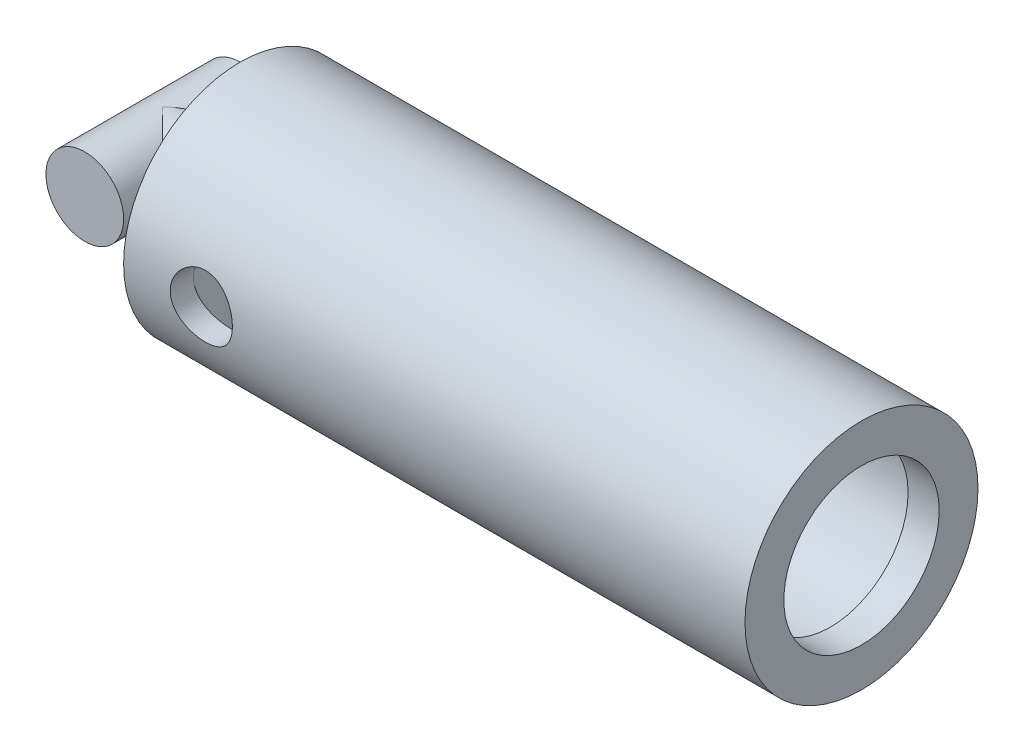
ISO-10303-21;
HEADER;
FILE_DESCRIPTION(('STEP AP214'),'2;1');
FILE_NAME('part.step','',(''),(''),'','','');
FILE_SCHEMA(('AUTOMOTIVE_DESIGN { 1 0 10303 214 1 1 1 1 }'));
ENDSEC;
DATA;
#1=APPLICATION_CONTEXT('core data for automotive mechanical design processes');
#2=APPLICATION_PROTOCOL_DEFINITION('international standard','automotive_design',2000,#1);
#3=PRODUCT_CONTEXT('',#1,'mechanical');
#4=PRODUCT('Part','Part','',(#3));
#5=PRODUCT_RELATED_PRODUCT_CATEGORY('part','',(#4));
#6=PRODUCT_DEFINITION_FORMATION('','',#4);
#7=PRODUCT_DEFINITION_CONTEXT('part definition',#1,'design');
#8=PRODUCT_DEFINITION('design','',#6,#7);
#9=PRODUCT_DEFINITION_SHAPE('','',#8);
#10=(LENGTH_UNIT() NAMED_UNIT(*) SI_UNIT(.MILLI.,.METRE.));
#11=(NAMED_UNIT(*) PLANE_ANGLE_UNIT() SI_UNIT($,.RADIAN.));
#12=(NAMED_UNIT(*) SI_UNIT($,.STERADIAN.) SOLID_ANGLE_UNIT());
#13=UNCERTAINTY_MEASURE_WITH_UNIT(LENGTH_MEASURE(1.E-05),#10,'distance_accuracy_value','');
#14=(GEOMETRIC_REPRESENTATION_CONTEXT(3) GLOBAL_UNCERTAINTY_ASSIGNED_CONTEXT((#13)) GLOBAL_UNIT_ASSIGNED_CONTEXT((#10,
#11,#12)) REPRESENTATION_CONTEXT('',''));
#15=CARTESIAN_POINT('',(0.,0.,0.));
#16=DIRECTION('',(0.,0.,1.));
#17=DIRECTION('',(1.,0.,0.));
#18=AXIS2_PLACEMENT_3D('',#15,#16,#17);
#19=CARTESIAN_POINT('',(0.,0.,0.));
#20=DIRECTION('',(1.,0.,0.));
#21=DIRECTION('',(0.,0.,-1.));
#22=AXIS2_PLACEMENT_3D('',#19,#20,#21);
#23=PLANE('',#22);
#24=CARTESIAN_POINT('',(0.,0.,0.));
#25=DIRECTION('',(1.,0.,0.));
#26=DIRECTION('',(0.,0.,-1.));
#27=AXIS2_PLACEMENT_3D('',#24,#25,#26);
#28=CIRCLE('',#27,7.5);
#29=CARTESIAN_POINT('',(0.,0.,-7.5));
#30=VERTEX_POINT('',#29);
#31=EDGE_CURVE('E87',#30,#30,#28,.T.);
#32=ORIENTED_EDGE('',*,*,#31,.F.);
#33=EDGE_LOOP('',(#32));
#34=FACE_BOUND('',#33,.T.);
#35=CARTESIAN_POINT('',(0.,0.,0.));
#36=DIRECTION('',(1.,0.,0.));
#37=DIRECTION('',(0.,0.,-1.));
#38=AXIS2_PLACEMENT_3D('',#35,#36,#37);
#39=CIRCLE('',#38,2.5);
#40=CARTESIAN_POINT('',(0.,0.,-2.5));
#41=VERTEX_POINT('',#40);
#42=EDGE_CURVE('E12',#41,#41,#39,.F.);
#43=ORIENTED_EDGE('',*,*,#42,.F.);
#44=EDGE_LOOP('',(#43));
#45=FACE_BOUND('',#44,.T.);
#46=ADVANCED_FACE('F35',(#34,#45),#23,.F.);
#47=CARTESIAN_POINT('',(40.,0.,0.));
#48=DIRECTION('',(-1.,0.,0.));
#49=DIRECTION('',(0.,0.,1.));
#50=AXIS2_PLACEMENT_3D('',#47,#48,#49);
#51=CYLINDRICAL_SURFACE('',#50,7.5);
#52=CARTESIAN_POINT('',(7.,0.,-7.5));
#53=CARTESIAN_POINT('',(6.99999738306515,0.110254555832854,-7.49999833810161));
#54=CARTESIAN_POINT('',(6.99085238581033,0.22053716022184,-7.49754486162151));
#55=CARTESIAN_POINT('',(6.95457876926131,0.437925451354464,-7.48799573621659));
#56=CARTESIAN_POINT('',(6.92744149557388,0.545029583319086,-7.48089785332586));
#57=CARTESIAN_POINT('',(6.85612833313597,0.752891589045312,-7.4628433325279));
#58=CARTESIAN_POINT('',(6.81197441233398,0.853657451015285,-7.45189167130375));
#59=CARTESIAN_POINT('',(6.70796275733338,1.04635368639266,-7.42728699151678));
#60=CARTESIAN_POINT('',(6.64810397664071,1.13828347044963,-7.4136337929518));
#61=CARTESIAN_POINT('',(6.51291648358663,1.31282950374002,-7.38474614901995));
#62=CARTESIAN_POINT('',(6.43729133199174,1.39521168986279,-7.36948467678681));
#63=CARTESIAN_POINT('',(6.27335151693665,1.54628713660638,-7.33927409679591));
#64=CARTESIAN_POINT('',(6.18503522238247,1.61497863495664,-7.32432502947243));
#65=CARTESIAN_POINT('',(5.99635176517455,1.73786409243415,-7.29615537464372));
#66=CARTESIAN_POINT('',(5.89580367173827,1.79178877736487,-7.28296888563239));
#67=CARTESIAN_POINT('',(5.68665988890757,1.88187548076994,-7.26021477318187));
#68=CARTESIAN_POINT('',(5.57806568766856,1.91804077451369,-7.25064648253265));
#69=CARTESIAN_POINT('',(5.35850446217499,1.97076920226504,-7.23649115802399));
#70=CARTESIAN_POINT('',(5.24764646006926,1.98775670244692,-7.2317964781149));
#71=CARTESIAN_POINT('',(5.02456231669346,2.0029703470582,-7.2275983091637));
#72=CARTESIAN_POINT('',(4.91233643497593,2.00119999705754,-7.22809385014446));
#73=CARTESIAN_POINT('',(4.69301458462594,1.97928510002699,-7.2341237880203));
#74=CARTESIAN_POINT('',(4.58586281796151,1.95965406064765,-7.23951735511531));
#75=CARTESIAN_POINT('',(4.37643166554376,1.90339748722183,-7.25451013080688));
#76=CARTESIAN_POINT('',(4.27415266992465,1.86677059492995,-7.26410967552612));
#77=CARTESIAN_POINT('',(4.07603185619142,1.77714356965256,-7.28655661748386));
#78=CARTESIAN_POINT('',(3.98027566071374,1.72396341137784,-7.29943942818703));
#79=CARTESIAN_POINT('',(3.79886584114848,1.60286503823778,-7.32698229642445));
#80=CARTESIAN_POINT('',(3.71321421084353,1.53494392224251,-7.34164270355186));
#81=CARTESIAN_POINT('',(3.5515110025452,1.38366607263419,-7.37167510629864));
#82=CARTESIAN_POINT('',(3.47586368168505,1.29987812728299,-7.38705471488831));
#83=CARTESIAN_POINT('',(3.33961121964971,1.12061766820637,-7.41636381276316));
#84=CARTESIAN_POINT('',(3.27900667129757,1.02514469420509,-7.43029324488555));
#85=CARTESIAN_POINT('',(3.17438209717535,0.824598255497451,-7.45521820398293));
#86=CARTESIAN_POINT('',(3.13043522955141,0.719484902551789,-7.4662007283356));
#87=CARTESIAN_POINT('',(3.06095281118663,0.503002294390395,-7.48390044400999));
#88=CARTESIAN_POINT('',(3.03541323727604,0.391634411928323,-7.49061856733749));
#89=CARTESIAN_POINT('',(3.00410512308217,0.169254083145515,-7.49889158558384));
#90=CARTESIAN_POINT('',(2.99778696014913,0.0583242376413797,-7.50058997470959));
#91=CARTESIAN_POINT('',(3.00358316424694,-0.163010045901199,-7.49904471691695));
#92=CARTESIAN_POINT('',(3.01569562610577,-0.273414537062114,-7.49580158080353));
#93=CARTESIAN_POINT('',(3.05755844745998,-0.48860244990178,-7.48483035496021));
#94=CARTESIAN_POINT('',(3.08700224619777,-0.593449852027783,-7.47718026546329));
#95=CARTESIAN_POINT('',(3.16233594450795,-0.796706971176065,-7.45826294894139));
#96=CARTESIAN_POINT('',(3.20822762625055,-0.895115989216028,-7.44699532996161));
#97=CARTESIAN_POINT('',(3.31617388718054,-1.08483847466795,-7.42175660559528));
#98=CARTESIAN_POINT('',(3.37852746679774,-1.17597518846118,-7.40773686604957));
#99=CARTESIAN_POINT('',(3.51725163015799,-1.34668463539715,-7.37861452365564));
#100=CARTESIAN_POINT('',(3.59362498260106,-1.42625507879918,-7.3635117072752));
#101=CARTESIAN_POINT('',(3.76078557749456,-1.57388924478774,-7.33339745866705));
#102=CARTESIAN_POINT('',(3.85191856139517,-1.64156519249816,-7.31840061429312));
#103=CARTESIAN_POINT('',(4.04456469609962,-1.76067191185118,-7.29066447182727));
#104=CARTESIAN_POINT('',(4.1460774136223,-1.81210336122161,-7.27792507956316));
#105=CARTESIAN_POINT('',(4.3560953070761,-1.89687411586112,-7.2562926837321));
#106=CARTESIAN_POINT('',(4.46455581181758,-1.93031812253958,-7.24737748318009));
#107=CARTESIAN_POINT('',(4.68583931967475,-1.97841205118791,-7.23439825126801));
#108=CARTESIAN_POINT('',(4.79866120034792,-1.99306677602478,-7.23033298020014));
#109=CARTESIAN_POINT('',(5.0214947878838,-2.00288989653714,-7.22761744573589));
#110=CARTESIAN_POINT('',(5.13147732025828,-1.99868155618109,-7.22879397743239));
#111=CARTESIAN_POINT('',(5.34910351401003,-1.97234376000439,-7.23602396081087));
#112=CARTESIAN_POINT('',(5.45674723550058,-1.95021476535025,-7.24207728699439));
#113=CARTESIAN_POINT('',(5.66585575212985,-1.88902515699699,-7.25827571073158));
#114=CARTESIAN_POINT('',(5.76736184273218,-1.8500966107558,-7.26838885019644));
#115=CARTESIAN_POINT('',(5.96247883053414,-1.75651554562386,-7.29156818136177));
#116=CARTESIAN_POINT('',(6.05608848630049,-1.70186056024617,-7.30463483621364));
#117=CARTESIAN_POINT('',(6.23573035949661,-1.57648909268817,-7.3327292144046));
#118=CARTESIAN_POINT('',(6.32145853497621,-1.50534729767909,-7.3478033310169));
#119=CARTESIAN_POINT('',(6.47996245166733,-1.349830535111,-7.37795503783007));
#120=CARTESIAN_POINT('',(6.55273503866884,-1.26545235435875,-7.39303262798441));
#121=CARTESIAN_POINT('',(6.68479223764686,-1.08367998108869,-7.42187812403968));
#122=CARTESIAN_POINT('',(6.74375501064933,-0.98604596175178,-7.43561111314551));
#123=CARTESIAN_POINT('',(6.84433741592936,-0.78188864041689,-7.45983810102897));
#124=CARTESIAN_POINT('',(6.8859681756636,-0.675371094696298,-7.47033417683594));
#125=CARTESIAN_POINT('',(6.94527528541552,-0.474374704880991,-7.48554752513468));
#126=CARTESIAN_POINT('',(6.9657493835925,-0.380762016565036,-7.49092770592602));
#127=CARTESIAN_POINT('',(6.99311220616706,-0.191439795317076,-7.49815449036456));
#128=CARTESIAN_POINT('',(7.00000227220002,-0.0957304704048604,-7.5000014429727));
#129=CARTESIAN_POINT('',(7.,0.,-7.5));
#130=B_SPLINE_CURVE_WITH_KNOTS('',3,(#52,#53,#54,#55,#56,#57,#58,#59,#60,#61,#62,#63,#64,#65,
#66,#67,#68,#69,#70,#71,#72,#73,#74,#75,#76,#77,#78,#79,#80,#81,#82,#83,#84,#85,#86,#87,#88,#89,
#90,#91,#92,#93,#94,#95,#96,#97,#98,#99,#100,#101,#102,#103,#104,#105,#106,#107,#108,#109,#110,
#111,#112,#113,#114,#115,#116,#117,#118,#119,#120,#121,#122,#123,#124,#125,#126,#127,#128,#129),
.UNSPECIFIED.,.T.,.F.,(4,2,2,2,2,2,2,2,2,2,2,2,2,2,2,2,2,2,2,2,2,2,2,2,2,2,2,2,2,2,2,2,2,2,2,2,
2,2,4),(0.,0.330412598949569,0.66098424376145,0.991130552971932,1.32129886708675,
1.65834897954967,1.99544244925149,2.33832582523229,2.681145941297,3.01622158250468,
3.3512346040432,3.67691002045997,4.0026114681294,4.33198673346498,4.6614268811763,
5.00161259812322,5.34181171937597,5.68348809603041,6.02508977190139,6.35682717524547,
6.68853028925351,7.01453535642116,7.34057575775614,7.6730028600455,8.00549568258887,
8.34736496382788,8.68921998024107,9.02906297699387,9.36881908663983,9.69743342403611,
10.0260393052059,10.352107654483,10.67822717123,11.0139433957139,11.3497412433245,
11.692722522809,12.0354832614518,12.3223981899334,12.6092847796638),.UNSPECIFIED.);
#131=CARTESIAN_POINT('',(7.,0.,-7.5));
#132=VERTEX_POINT('',#131);
#133=EDGE_CURVE('E143',#132,#132,#130,.T.);
#134=ORIENTED_EDGE('',*,*,#133,.T.);
#135=EDGE_LOOP('',(#134));
#136=FACE_BOUND('',#135,.T.);
#137=CARTESIAN_POINT('',(7.,0.,7.5));
#138=CARTESIAN_POINT('',(6.99999738306515,-0.110254555832854,7.49999833810161));
#139=CARTESIAN_POINT('',(6.99085238581033,-0.22053716022184,7.49754486162151));
#140=CARTESIAN_POINT('',(6.95457876926131,-0.437925451354464,7.48799573621659));
#141=CARTESIAN_POINT('',(6.92744149557388,-0.545029583319086,7.48089785332586));
#142=CARTESIAN_POINT('',(6.85612833313597,-0.752891589045312,7.4628433325279));
#143=CARTESIAN_POINT('',(6.81197441233398,-0.853657451015285,7.45189167130375));
#144=CARTESIAN_POINT('',(6.70796275733338,-1.04635368639266,7.42728699151678));
#145=CARTESIAN_POINT('',(6.64810397664071,-1.13828347044963,7.4136337929518));
#146=CARTESIAN_POINT('',(6.51291648358663,-1.31282950374002,7.38474614901995));
#147=CARTESIAN_POINT('',(6.43729133199174,-1.39521168986279,7.36948467678681));
#148=CARTESIAN_POINT('',(6.27335151693665,-1.54628713660638,7.33927409679591));
#149=CARTESIAN_POINT('',(6.18503522238247,-1.61497863495664,7.32432502947243));
#150=CARTESIAN_POINT('',(5.99635176517455,-1.73786409243415,7.29615537464372));
#151=CARTESIAN_POINT('',(5.89580367173827,-1.79178877736487,7.28296888563239));
#152=CARTESIAN_POINT('',(5.68665988890757,-1.88187548076994,7.26021477318187));
#153=CARTESIAN_POINT('',(5.57806568766856,-1.91804077451369,7.25064648253265));
#154=CARTESIAN_POINT('',(5.35850446217499,-1.97076920226504,7.23649115802399));
#155=CARTESIAN_POINT('',(5.24764646006926,-1.98775670244692,7.2317964781149));
#156=CARTESIAN_POINT('',(5.02456231669346,-2.0029703470582,7.2275983091637));
#157=CARTESIAN_POINT('',(4.91233643497593,-2.00119999705754,7.22809385014446));
#158=CARTESIAN_POINT('',(4.69301458462594,-1.97928510002699,7.2341237880203));
#159=CARTESIAN_POINT('',(4.58586281796151,-1.95965406064765,7.23951735511531));
#160=CARTESIAN_POINT('',(4.37643166554376,-1.90339748722183,7.25451013080688));
#161=CARTESIAN_POINT('',(4.27415266992465,-1.86677059492995,7.26410967552612));
#162=CARTESIAN_POINT('',(4.07603185619142,-1.77714356965256,7.28655661748386));
#163=CARTESIAN_POINT('',(3.98027566071374,-1.72396341137784,7.29943942818703));
#164=CARTESIAN_POINT('',(3.79886584114848,-1.60286503823778,7.32698229642445));
#165=CARTESIAN_POINT('',(3.71321421084353,-1.53494392224251,7.34164270355186));
#166=CARTESIAN_POINT('',(3.5515110025452,-1.38366607263419,7.37167510629864));
#167=CARTESIAN_POINT('',(3.47586368168505,-1.29987812728299,7.38705471488831));
#168=CARTESIAN_POINT('',(3.33961121964971,-1.12061766820637,7.41636381276316));
#169=CARTESIAN_POINT('',(3.27900667129757,-1.02514469420509,7.43029324488555));
#170=CARTESIAN_POINT('',(3.17438209717535,-0.824598255497451,7.45521820398293));
#171=CARTESIAN_POINT('',(3.13043522955141,-0.719484902551789,7.4662007283356));
#172=CARTESIAN_POINT('',(3.06095281118663,-0.503002294390395,7.48390044400999));
#173=CARTESIAN_POINT('',(3.03541323727604,-0.391634411928323,7.49061856733749));
#174=CARTESIAN_POINT('',(3.00410512308217,-0.169254083145515,7.49889158558384));
#175=CARTESIAN_POINT('',(2.99778696014913,-0.0583242376413797,7.50058997470959));
#176=CARTESIAN_POINT('',(3.00358316424694,0.163010045901199,7.49904471691695));
#177=CARTESIAN_POINT('',(3.01569562610577,0.273414537062114,7.49580158080353));
#178=CARTESIAN_POINT('',(3.05755844745998,0.48860244990178,7.48483035496021));
#179=CARTESIAN_POINT('',(3.08700224619777,0.593449852027783,7.47718026546329));
#180=CARTESIAN_POINT('',(3.16233594450795,0.796706971176065,7.45826294894139));
#181=CARTESIAN_POINT('',(3.20822762625055,0.895115989216028,7.44699532996161));
#182=CARTESIAN_POINT('',(3.31617388718054,1.08483847466795,7.42175660559528));
#183=CARTESIAN_POINT('',(3.37852746679774,1.17597518846118,7.40773686604957));
#184=CARTESIAN_POINT('',(3.51725163015799,1.34668463539715,7.37861452365564));
#185=CARTESIAN_POINT('',(3.59362498260106,1.42625507879918,7.3635117072752));
#186=CARTESIAN_POINT('',(3.76078557749456,1.57388924478774,7.33339745866705));
#187=CARTESIAN_POINT('',(3.85191856139517,1.64156519249816,7.31840061429312));
#188=CARTESIAN_POINT('',(4.04456469609962,1.76067191185118,7.29066447182727));
#189=CARTESIAN_POINT('',(4.1460774136223,1.81210336122161,7.27792507956316));
#190=CARTESIAN_POINT('',(4.3560953070761,1.89687411586112,7.2562926837321));
#191=CARTESIAN_POINT('',(4.46455581181758,1.93031812253958,7.24737748318009));
#192=CARTESIAN_POINT('',(4.68583931967475,1.97841205118791,7.23439825126801));
#193=CARTESIAN_POINT('',(4.79866120034792,1.99306677602478,7.23033298020014));
#194=CARTESIAN_POINT('',(5.0214947878838,2.00288989653714,7.22761744573589));
#195=CARTESIAN_POINT('',(5.13147732025828,1.99868155618109,7.22879397743239));
#196=CARTESIAN_POINT('',(5.34910351401003,1.97234376000439,7.23602396081087));
#197=CARTESIAN_POINT('',(5.45674723550058,1.95021476535025,7.24207728699439));
#198=CARTESIAN_POINT('',(5.66585575212985,1.88902515699699,7.25827571073158));
#199=CARTESIAN_POINT('',(5.76736184273218,1.8500966107558,7.26838885019644));
#200=CARTESIAN_POINT('',(5.96247883053414,1.75651554562386,7.29156818136177));
#201=CARTESIAN_POINT('',(6.05608848630049,1.70186056024617,7.30463483621364));
#202=CARTESIAN_POINT('',(6.23573035949661,1.57648909268817,7.3327292144046));
#203=CARTESIAN_POINT('',(6.32145853497621,1.50534729767909,7.3478033310169));
#204=CARTESIAN_POINT('',(6.47996245166733,1.349830535111,7.37795503783007));
#205=CARTESIAN_POINT('',(6.55273503866884,1.26545235435875,7.39303262798441));
#206=CARTESIAN_POINT('',(6.68479223764686,1.08367998108869,7.42187812403968));
#207=CARTESIAN_POINT('',(6.74375501064933,0.98604596175178,7.43561111314551));
#208=CARTESIAN_POINT('',(6.84433741592936,0.78188864041689,7.45983810102897));
#209=CARTESIAN_POINT('',(6.8859681756636,0.675371094696298,7.47033417683594));
#210=CARTESIAN_POINT('',(6.94527528541552,0.474374704880991,7.48554752513468));
#211=CARTESIAN_POINT('',(6.9657493835925,0.380762016565036,7.49092770592602));
#212=CARTESIAN_POINT('',(6.99311220616706,0.191439795317076,7.49815449036456));
#213=CARTESIAN_POINT('',(7.00000227220002,0.0957304704048604,7.5000014429727));
#214=CARTESIAN_POINT('',(7.,0.,7.5));
#215=B_SPLINE_CURVE_WITH_KNOTS('',3,(#137,#138,#139,#140,#141,#142,#143,#144,#145,#146,#147,
#148,#149,#150,#151,#152,#153,#154,#155,#156,#157,#158,#159,#160,#161,#162,#163,#164,#165,#166,
#167,#168,#169,#170,#171,#172,#173,#174,#175,#176,#177,#178,#179,#180,#181,#182,#183,#184,#185,
#186,#187,#188,#189,#190,#191,#192,#193,#194,#195,#196,#197,#198,#199,#200,#201,#202,#203,#204,
#205,#206,#207,#208,#209,#210,#211,#212,#213,#214),.UNSPECIFIED.,.T.,.F.,(4,2,2,2,2,2,2,2,2,2,2,
2,2,2,2,2,2,2,2,2,2,2,2,2,2,2,2,2,2,2,2,2,2,2,2,2,2,2,4),(0.,0.330412598949569,0.66098424376145,
0.991130552971932,1.32129886708675,1.65834897954967,1.99544244925149,2.33832582523229,
2.681145941297,3.01622158250468,3.3512346040432,3.67691002045997,4.0026114681294,
4.33198673346498,4.6614268811763,5.00161259812322,5.34181171937597,5.68348809603041,
6.02508977190139,6.35682717524547,6.68853028925351,7.01453535642116,7.34057575775614,
7.6730028600455,8.00549568258887,8.34736496382788,8.68921998024107,9.02906297699387,
9.36881908663983,9.69743342403611,10.0260393052059,10.352107654483,10.67822717123,
11.0139433957139,11.3497412433245,11.692722522809,12.0354832614518,12.3223981899334,
12.6092847796638),.UNSPECIFIED.);
#216=CARTESIAN_POINT('',(7.,0.,7.5));
#217=VERTEX_POINT('',#216);
#218=EDGE_CURVE('E130',#217,#217,#215,.T.);
#219=ORIENTED_EDGE('',*,*,#218,.T.);
#220=EDGE_LOOP('',(#219));
#221=FACE_BOUND('',#220,.T.);
#222=CARTESIAN_POINT('',(40.,0.,0.));
#223=DIRECTION('',(1.,0.,0.));
#224=DIRECTION('',(0.,0.,-1.));
#225=AXIS2_PLACEMENT_3D('',#222,#223,#224);
#226=CIRCLE('',#225,7.5);
#227=CARTESIAN_POINT('',(40.,0.,-7.5));
#228=VERTEX_POINT('',#227);
#229=EDGE_CURVE('E44',#228,#228,#226,.T.);
#230=ORIENTED_EDGE('',*,*,#229,.F.);
#231=EDGE_LOOP('',(#230));
#232=FACE_BOUND('',#231,.T.);
#233=ORIENTED_EDGE('',*,*,#31,.T.);
#234=EDGE_LOOP('',(#233));
#235=FACE_BOUND('',#234,.T.);
#236=ADVANCED_FACE('F37',(#136,#221,#232,#235),#51,.T.);
#237=CARTESIAN_POINT('',(40.,0.,0.));
#238=DIRECTION('',(1.,0.,0.));
#239=DIRECTION('',(0.,0.,-1.));
#240=AXIS2_PLACEMENT_3D('',#237,#238,#239);
#241=PLANE('',#240);
#242=CARTESIAN_POINT('',(40.,0.,0.));
#243=DIRECTION('',(1.,0.,0.));
#244=DIRECTION('',(0.,0.,-1.));
#245=AXIS2_PLACEMENT_3D('',#242,#243,#244);
#246=CIRCLE('',#245,5.);
#247=CARTESIAN_POINT('',(40.,0.,-5.));
#248=VERTEX_POINT('',#247);
#249=EDGE_CURVE('E84',#248,#248,#246,.T.);
#250=ORIENTED_EDGE('',*,*,#249,.F.);
#251=EDGE_LOOP('',(#250));
#252=FACE_BOUND('',#251,.T.);
#253=ORIENTED_EDGE('',*,*,#229,.T.);
#254=EDGE_LOOP('',(#253));
#255=FACE_BOUND('',#254,.T.);
#256=ADVANCED_FACE('F171',(#252,#255),#241,.T.);
#257=CARTESIAN_POINT('',(38.,0.,0.));
#258=DIRECTION('',(1.,0.,0.));
#259=DIRECTION('',(0.,0.,-1.));
#260=AXIS2_PLACEMENT_3D('',#257,#258,#259);
#261=CYLINDRICAL_SURFACE('',#260,5.);
#262=CARTESIAN_POINT('',(38.,0.,0.));
#263=DIRECTION('',(1.,0.,0.));
#264=DIRECTION('',(0.,0.,-1.));
#265=AXIS2_PLACEMENT_3D('',#262,#263,#264);
#266=CIRCLE('',#265,5.);
#267=CARTESIAN_POINT('',(38.,0.,-5.));
#268=VERTEX_POINT('',#267);
#269=EDGE_CURVE('E80',#268,#268,#266,.F.);
#270=ORIENTED_EDGE('',*,*,#269,.T.);
#271=EDGE_LOOP('',(#270));
#272=FACE_BOUND('',#271,.T.);
#273=ORIENTED_EDGE('',*,*,#249,.T.);
#274=EDGE_LOOP('',(#273));
#275=FACE_BOUND('',#274,.T.);
#276=ADVANCED_FACE('F114',(#272,#275),#261,.F.);
#277=CARTESIAN_POINT('',(38.,0.,0.));
#278=DIRECTION('',(1.,0.,0.));
#279=DIRECTION('',(0.,0.,-1.));
#280=AXIS2_PLACEMENT_3D('',#277,#278,#279);
#281=PLANE('',#280);
#282=CARTESIAN_POINT('',(38.,0.,0.));
#283=DIRECTION('',(1.,0.,0.));
#284=DIRECTION('',(0.,0.,-1.));
#285=AXIS2_PLACEMENT_3D('',#282,#283,#284);
#286=CIRCLE('',#285,6.);
#287=CARTESIAN_POINT('',(38.,0.,-6.));
#288=VERTEX_POINT('',#287);
#289=EDGE_CURVE('E71',#288,#288,#286,.T.);
#290=ORIENTED_EDGE('',*,*,#289,.F.);
#291=EDGE_LOOP('',(#290));
#292=FACE_BOUND('',#291,.T.);
#293=ORIENTED_EDGE('',*,*,#269,.F.);
#294=EDGE_LOOP('',(#293));
#295=FACE_BOUND('',#294,.T.);
#296=ADVANCED_FACE('F111',(#292,#295),#281,.F.);
#297=CARTESIAN_POINT('',(3.,0.,0.));
#298=DIRECTION('',(1.,0.,0.));
#299=DIRECTION('',(0.,0.,-1.));
#300=AXIS2_PLACEMENT_3D('',#297,#298,#299);
#301=CYLINDRICAL_SURFACE('',#300,6.);
#302=CARTESIAN_POINT('',(3.,0.,0.));
#303=DIRECTION('',(1.,0.,0.));
#304=DIRECTION('',(0.,0.,-1.));
#305=AXIS2_PLACEMENT_3D('',#302,#303,#304);
#306=CIRCLE('',#305,6.);
#307=CARTESIAN_POINT('',(3.,0.,-6.));
#308=VERTEX_POINT('',#307);
#309=CARTESIAN_POINT('',(3.,0.,6.));
#310=VERTEX_POINT('',#309);
#311=EDGE_CURVE('E78',#308,#310,#306,.T.);
#312=ORIENTED_EDGE('',*,*,#311,.F.);
#313=CARTESIAN_POINT('',(3.,0.,-6.));
#314=CARTESIAN_POINT('',(2.99999949253672,0.109126725773447,-6.00000030601888));
#315=CARTESIAN_POINT('',(3.00896053225443,0.2182503890771,-5.9969953901509));
#316=CARTESIAN_POINT('',(3.04445821763444,0.433283521745944,-5.98530420406562));
#317=CARTESIAN_POINT('',(3.07099668789784,0.539192656237635,-5.97661734404305));
#318=CARTESIAN_POINT('',(3.1406384867681,0.744665579003552,-5.95450615812885));
#319=CARTESIAN_POINT('',(3.18371412491854,0.844239651772068,-5.94108975461707));
#320=CARTESIAN_POINT('',(3.28508234567669,1.03474987361065,-5.91088891434684));
#321=CARTESIAN_POINT('',(3.3433779300052,1.12568431391741,-5.89410381335556));
#322=CARTESIAN_POINT('',(3.4756516097175,1.29948335004453,-5.8582818888601));
#323=CARTESIAN_POINT('',(3.55006246852099,1.38200740059662,-5.8391911292757));
#324=CARTESIAN_POINT('',(3.71153430941313,1.53366538540417,-5.80120629566243));
#325=CARTESIAN_POINT('',(3.79859806985702,1.60279637097893,-5.78231226581098));
#326=CARTESIAN_POINT('',(3.98597023039292,1.72764988445572,-5.74626664954548));
#327=CARTESIAN_POINT('',(4.08658747946424,1.78292971644206,-5.72918078551376));
#328=CARTESIAN_POINT('',(4.29635218891709,1.87563774775544,-5.69950610837202));
#329=CARTESIAN_POINT('',(4.40549703432549,1.91307139477353,-5.68691592321491));
#330=CARTESIAN_POINT('',(4.62534644299342,1.96774692301833,-5.66822606538755));
#331=CARTESIAN_POINT('',(4.73587441697813,1.98562689654354,-5.66192191539223));
#332=CARTESIAN_POINT('',(4.95852750831176,2.00268224666895,-5.65591313259015));
#333=CARTESIAN_POINT('',(5.07065212141838,2.00186340320944,-5.6562064604546));
#334=CARTESIAN_POINT('',(5.28787326088804,1.98203980740684,-5.6631803001636));
#335=CARTESIAN_POINT('',(5.39305680583804,1.96386782633399,-5.66956831735066));
#336=CARTESIAN_POINT('',(5.59878683921367,1.91121232569884,-5.68753315449102));
#337=CARTESIAN_POINT('',(5.69933277087014,1.87672685318374,-5.69911059568215));
#338=CARTESIAN_POINT('',(5.89482549918296,1.79187811612042,-5.72635822262498));
#339=CARTESIAN_POINT('',(5.98965605093905,1.74126809741453,-5.74209131586235));
#340=CARTESIAN_POINT('',(6.16974181655945,1.62577821260628,-5.77585117151453));
#341=CARTESIAN_POINT('',(6.25499425386676,1.56089422472801,-5.79387859580927));
#342=CARTESIAN_POINT('',(6.41818319632154,1.41469866536448,-5.83134658335482));
#343=CARTESIAN_POINT('',(6.49550538901814,1.33270630015262,-5.85081178709686));
#344=CARTESIAN_POINT('',(6.6354625333268,1.15667913994013,-5.88813876774073));
#345=CARTESIAN_POINT('',(6.69809607632899,1.06264319132163,-5.90600039076135));
#346=CARTESIAN_POINT('',(6.80739260047014,0.863895226092536,-5.93834215875587));
#347=CARTESIAN_POINT('',(6.85389098268146,0.759086552832673,-5.95278700016078));
#348=CARTESIAN_POINT('',(6.92840634791142,0.542538166729015,-5.9764113428887));
#349=CARTESIAN_POINT('',(6.95642975084688,0.430800876309908,-5.98559267309759));
#350=CARTESIAN_POINT('',(6.99211133204472,0.208767659058609,-5.99735254142881));
#351=CARTESIAN_POINT('',(7.0005996183455,0.0986191997296928,-6.00020003667456));
#352=CARTESIAN_POINT('',(6.99933465280306,-0.121550139920474,-5.99977805389655));
#353=CARTESIAN_POINT('',(6.98958448004025,-0.2315710386393,-5.99650960838725));
#354=CARTESIAN_POINT('',(6.95277618452808,-0.445039732608511,-5.98440049434209));
#355=CARTESIAN_POINT('',(6.92622758790101,-0.548585613669687,-5.97572397422385));
#356=CARTESIAN_POINT('',(6.85721311106654,-0.749711917159147,-5.9538369366014));
#357=CARTESIAN_POINT('',(6.81474520106443,-0.847291577017213,-5.9406258409335));
#358=CARTESIAN_POINT('',(6.71385913631843,-1.03657659278655,-5.91057862574579));
#359=CARTESIAN_POINT('',(6.65505081343366,-1.12805991843429,-5.89365629511572));
#360=CARTESIAN_POINT('',(6.52361169997303,-1.30012966027117,-5.85810507832525));
#361=CARTESIAN_POINT('',(6.45097668793647,-1.38071273559115,-5.83947567187655));
#362=CARTESIAN_POINT('',(6.29004249798682,-1.5325050156126,-5.8015369596089));
#363=CARTESIAN_POINT('',(6.20118154614628,-1.60312193849154,-5.78223522174856));
#364=CARTESIAN_POINT('',(6.01245686437823,-1.72851504464715,-5.74599946589418));
#365=CARTESIAN_POINT('',(5.91259304273185,-1.78329109586203,-5.72906546764005));
#366=CARTESIAN_POINT('',(5.70465396942021,-1.87519386083272,-5.69964783582767));
#367=CARTESIAN_POINT('',(5.59659584166247,-1.91235626433004,-5.68715521585958));
#368=CARTESIAN_POINT('',(5.37524269991174,-1.96778933351871,-5.66821664612899));
#369=CARTESIAN_POINT('',(5.2619500691913,-1.98606850990788,-5.66176797247279));
#370=CARTESIAN_POINT('',(5.03960580791817,-2.00255256495468,-5.65595717748354));
#371=CARTESIAN_POINT('',(4.93063531942635,-2.0017405146168,-5.6562480051483));
#372=CARTESIAN_POINT('',(4.71446985015587,-1.98248458689739,-5.66302539647735));
#373=CARTESIAN_POINT('',(4.60727476408982,-1.96404175891717,-5.66951159138723));
#374=CARTESIAN_POINT('',(4.39972867399505,-1.91074362625869,-5.68769048609783));
#375=CARTESIAN_POINT('',(4.29928634999101,-1.87620669203103,-5.69928196044955));
#376=CARTESIAN_POINT('',(4.10554518612346,-1.79195873151949,-5.72632797636937));
#377=CARTESIAN_POINT('',(4.01224793762399,-1.74224433710761,-5.74178337526786));
#378=CARTESIAN_POINT('',(3.83103266015418,-1.62652138516686,-5.77565658452093));
#379=CARTESIAN_POINT('',(3.74352699620323,-1.55989648552916,-5.79417423284274));
#380=CARTESIAN_POINT('',(3.5806203732316,-1.4132857662713,-5.83166712566506));
#381=CARTESIAN_POINT('',(3.50522284862385,-1.33329616890296,-5.85064249824745));
#382=CARTESIAN_POINT('',(3.36571117542164,-1.15848311384138,-5.88780061051088));
#383=CARTESIAN_POINT('',(3.302151304498,-1.06320302699946,-5.90592363602513));
#384=CARTESIAN_POINT('',(3.19201914229871,-0.862714714813249,-5.93851982345224));
#385=CARTESIAN_POINT('',(3.14544250815592,-0.757509036264697,-5.9529939181586));
#386=CARTESIAN_POINT('',(3.07255673502266,-0.544987294401952,-5.97611030137084));
#387=CARTESIAN_POINT('',(3.04543506747325,-0.437975515352818,-5.98498424845045));
#388=CARTESIAN_POINT('',(3.00915943864575,-0.220640832020494,-5.99692814128444));
#389=CARTESIAN_POINT('',(3.00000051300693,-0.110318851137493,-5.9999996906381));
#390=CARTESIAN_POINT('',(3.,0.,-6.));
#391=B_SPLINE_CURVE_WITH_KNOTS('',3,(#313,#314,#315,#316,#317,#318,#319,#320,#321,#322,#323,
#324,#325,#326,#327,#328,#329,#330,#331,#332,#333,#334,#335,#336,#337,#338,#339,#340,#341,#342,
#343,#344,#345,#346,#347,#348,#349,#350,#351,#352,#353,#354,#355,#356,#357,#358,#359,#360,#361,
#362,#363,#364,#365,#366,#367,#368,#369,#370,#371,#372,#373,#374,#375,#376,#377,#378,#379,#380,
#381,#382,#383,#384,#385,#386,#387,#388,#389,#390),.UNSPECIFIED.,.T.,.F.,(4,2,2,2,2,2,2,2,2,2,2,
2,2,2,2,2,2,2,2,2,2,2,2,2,2,2,2,2,2,2,2,2,2,2,2,2,2,2,4),(0.,0.326974212052022,
0.653982370535041,0.980445345740548,1.3069727555982,1.64369368565512,1.98048866575061,
2.32696769646941,2.67334089385667,3.0080385148368,3.34263267974971,3.6619365310256,
3.98127861710964,4.30576342310261,4.63034205116414,4.97186611622734,5.31342291933237,
5.65836811300715,6.00319337754417,6.33307166350339,6.66289426328353,6.98316315956427,
7.30347290568208,7.63220799687473,7.96104361643783,8.30482045761504,8.64860016469994,
8.99168027653541,9.3346056941168,9.65991332128517,9.98520158702751,10.3043117416084,
10.6234927635196,10.9566013338361,11.2898042224756,11.635993216702,11.9820936230491,
12.3127311674763,12.6432773207628),.UNSPECIFIED.);
#392=EDGE_CURVE('E54',#308,#308,#391,.T.);
#393=ORIENTED_EDGE('',*,*,#392,.T.);
#394=EDGE_CURVE('E74',#310,#308,#306,.T.);
#395=ORIENTED_EDGE('',*,*,#394,.F.);
#396=CARTESIAN_POINT('',(3.,0.,6.));
#397=CARTESIAN_POINT('',(2.99999949253671,-0.109126725773446,6.00000030601888));
#398=CARTESIAN_POINT('',(3.00896053225443,-0.218250389077099,5.9969953901509));
#399=CARTESIAN_POINT('',(3.04445821763444,-0.433283521745944,5.98530420406562));
#400=CARTESIAN_POINT('',(3.07099668789784,-0.539192656237635,5.97661734404305));
#401=CARTESIAN_POINT('',(3.1406384867681,-0.744665579003552,5.95450615812885));
#402=CARTESIAN_POINT('',(3.18371412491854,-0.844239651772068,5.94108975461707));
#403=CARTESIAN_POINT('',(3.28508234567669,-1.03474987361065,5.91088891434684));
#404=CARTESIAN_POINT('',(3.3433779300052,-1.12568431391741,5.89410381335556));
#405=CARTESIAN_POINT('',(3.4756516097175,-1.29948335004453,5.8582818888601));
#406=CARTESIAN_POINT('',(3.55006246852099,-1.38200740059662,5.8391911292757));
#407=CARTESIAN_POINT('',(3.71153430941313,-1.53366538540417,5.80120629566243));
#408=CARTESIAN_POINT('',(3.79859806985702,-1.60279637097893,5.78231226581098));
#409=CARTESIAN_POINT('',(3.98597023039292,-1.72764988445572,5.74626664954548));
#410=CARTESIAN_POINT('',(4.08658747946424,-1.78292971644206,5.72918078551376));
#411=CARTESIAN_POINT('',(4.29635218891709,-1.87563774775544,5.69950610837202));
#412=CARTESIAN_POINT('',(4.40549703432549,-1.91307139477353,5.68691592321491));
#413=CARTESIAN_POINT('',(4.62534644299342,-1.96774692301833,5.66822606538755));
#414=CARTESIAN_POINT('',(4.73587441697813,-1.98562689654354,5.66192191539223));
#415=CARTESIAN_POINT('',(4.95852750831176,-2.00268224666895,5.65591313259015));
#416=CARTESIAN_POINT('',(5.07065212141838,-2.00186340320944,5.6562064604546));
#417=CARTESIAN_POINT('',(5.28787326088804,-1.98203980740684,5.6631803001636));
#418=CARTESIAN_POINT('',(5.39305680583804,-1.96386782633399,5.66956831735066));
#419=CARTESIAN_POINT('',(5.59878683921367,-1.91121232569884,5.68753315449102));
#420=CARTESIAN_POINT('',(5.69933277087014,-1.87672685318374,5.69911059568215));
#421=CARTESIAN_POINT('',(5.89482549918296,-1.79187811612042,5.72635822262498));
#422=CARTESIAN_POINT('',(5.98965605093905,-1.74126809741453,5.74209131586235));
#423=CARTESIAN_POINT('',(6.16974181655945,-1.62577821260628,5.77585117151453));
#424=CARTESIAN_POINT('',(6.25499425386676,-1.56089422472801,5.79387859580927));
#425=CARTESIAN_POINT('',(6.41818319632154,-1.41469866536448,5.83134658335482));
#426=CARTESIAN_POINT('',(6.49550538901814,-1.33270630015262,5.85081178709686));
#427=CARTESIAN_POINT('',(6.6354625333268,-1.15667913994013,5.88813876774073));
#428=CARTESIAN_POINT('',(6.69809607632899,-1.06264319132163,5.90600039076135));
#429=CARTESIAN_POINT('',(6.80739260047014,-0.863895226092536,5.93834215875587));
#430=CARTESIAN_POINT('',(6.85389098268146,-0.759086552832673,5.95278700016078));
#431=CARTESIAN_POINT('',(6.92840634791142,-0.542538166729015,5.9764113428887));
#432=CARTESIAN_POINT('',(6.95642975084688,-0.430800876309908,5.98559267309759));
#433=CARTESIAN_POINT('',(6.99211133204472,-0.208767659058609,5.99735254142881));
#434=CARTESIAN_POINT('',(7.0005996183455,-0.0986191997296928,6.00020003667456));
#435=CARTESIAN_POINT('',(6.99933465280306,0.121550139920474,5.99977805389655));
#436=CARTESIAN_POINT('',(6.98958448004025,0.2315710386393,5.99650960838725));
#437=CARTESIAN_POINT('',(6.95277618452808,0.445039732608511,5.98440049434209));
#438=CARTESIAN_POINT('',(6.92622758790101,0.548585613669687,5.97572397422385));
#439=CARTESIAN_POINT('',(6.85721311106654,0.749711917159147,5.9538369366014));
#440=CARTESIAN_POINT('',(6.81474520106443,0.847291577017213,5.9406258409335));
#441=CARTESIAN_POINT('',(6.71385913631843,1.03657659278655,5.91057862574579));
#442=CARTESIAN_POINT('',(6.65505081343366,1.12805991843429,5.89365629511572));
#443=CARTESIAN_POINT('',(6.52361169997303,1.30012966027117,5.85810507832525));
#444=CARTESIAN_POINT('',(6.45097668793647,1.38071273559115,5.83947567187655));
#445=CARTESIAN_POINT('',(6.29004249798682,1.5325050156126,5.8015369596089));
#446=CARTESIAN_POINT('',(6.20118154614628,1.60312193849154,5.78223522174856));
#447=CARTESIAN_POINT('',(6.01245686437823,1.72851504464715,5.74599946589418));
#448=CARTESIAN_POINT('',(5.91259304273185,1.78329109586203,5.72906546764005));
#449=CARTESIAN_POINT('',(5.70465396942021,1.87519386083272,5.69964783582767));
#450=CARTESIAN_POINT('',(5.59659584166247,1.91235626433004,5.68715521585958));
#451=CARTESIAN_POINT('',(5.37524269991174,1.96778933351871,5.66821664612899));
#452=CARTESIAN_POINT('',(5.2619500691913,1.98606850990788,5.66176797247279));
#453=CARTESIAN_POINT('',(5.03960580791817,2.00255256495468,5.65595717748354));
#454=CARTESIAN_POINT('',(4.93063531942635,2.0017405146168,5.6562480051483));
#455=CARTESIAN_POINT('',(4.71446985015587,1.98248458689739,5.66302539647735));
#456=CARTESIAN_POINT('',(4.60727476408982,1.96404175891717,5.66951159138723));
#457=CARTESIAN_POINT('',(4.39972867399505,1.91074362625869,5.68769048609783));
#458=CARTESIAN_POINT('',(4.29928634999101,1.87620669203103,5.69928196044955));
#459=CARTESIAN_POINT('',(4.10554518612346,1.79195873151949,5.72632797636937));
#460=CARTESIAN_POINT('',(4.01224793762399,1.74224433710761,5.74178337526786));
#461=CARTESIAN_POINT('',(3.83103266015418,1.62652138516686,5.77565658452093));
#462=CARTESIAN_POINT('',(3.74352699620323,1.55989648552916,5.79417423284274));
#463=CARTESIAN_POINT('',(3.5806203732316,1.4132857662713,5.83166712566506));
#464=CARTESIAN_POINT('',(3.50522284862385,1.33329616890296,5.85064249824745));
#465=CARTESIAN_POINT('',(3.36571117542164,1.15848311384138,5.88780061051088));
#466=CARTESIAN_POINT('',(3.302151304498,1.06320302699946,5.90592363602513));
#467=CARTESIAN_POINT('',(3.19201914229871,0.862714714813249,5.93851982345224));
#468=CARTESIAN_POINT('',(3.14544250815591,0.757509036264697,5.9529939181586));
#469=CARTESIAN_POINT('',(3.07255673502266,0.544987294401952,5.97611030137084));
#470=CARTESIAN_POINT('',(3.04543506747325,0.437975515352818,5.98498424845045));
#471=CARTESIAN_POINT('',(3.00915943864575,0.220640832020494,5.99692814128444));
#472=CARTESIAN_POINT('',(3.00000051300692,0.110318851137493,5.9999996906381));
#473=CARTESIAN_POINT('',(3.,0.,6.));
#474=B_SPLINE_CURVE_WITH_KNOTS('',3,(#396,#397,#398,#399,#400,#401,#402,#403,#404,#405,#406,
#407,#408,#409,#410,#411,#412,#413,#414,#415,#416,#417,#418,#419,#420,#421,#422,#423,#424,#425,
#426,#427,#428,#429,#430,#431,#432,#433,#434,#435,#436,#437,#438,#439,#440,#441,#442,#443,#444,
#445,#446,#447,#448,#449,#450,#451,#452,#453,#454,#455,#456,#457,#458,#459,#460,#461,#462,#463,
#464,#465,#466,#467,#468,#469,#470,#471,#472,#473),.UNSPECIFIED.,.T.,.F.,(4,2,2,2,2,2,2,2,2,2,2,
2,2,2,2,2,2,2,2,2,2,2,2,2,2,2,2,2,2,2,2,2,2,2,2,2,2,2,4),(0.,0.326974212052022,
0.653982370535042,0.980445345740548,1.3069727555982,1.64369368565512,1.98048866575061,
2.32696769646941,2.67334089385667,3.0080385148368,3.34263267974971,3.6619365310256,
3.98127861710964,4.30576342310261,4.63034205116414,4.97186611622734,5.31342291933237,
5.65836811300715,6.00319337754417,6.33307166350339,6.66289426328353,6.98316315956427,
7.30347290568208,7.63220799687473,7.96104361643783,8.30482045761504,8.64860016469994,
8.99168027653541,9.3346056941168,9.65991332128517,9.98520158702751,10.3043117416084,
10.6234927635196,10.9566013338361,11.2898042224756,11.635993216702,11.9820936230491,
12.3127311674763,12.6432773207628),.UNSPECIFIED.);
#475=EDGE_CURVE('E49',#310,#310,#474,.T.);
#476=ORIENTED_EDGE('',*,*,#475,.T.);
#477=EDGE_LOOP('',(#312,#393,#395,#476));
#478=FACE_BOUND('',#477,.T.);
#479=ORIENTED_EDGE('',*,*,#289,.T.);
#480=EDGE_LOOP('',(#479));
#481=FACE_BOUND('',#480,.T.);
#482=ADVANCED_FACE('F106',(#478,#481),#301,.F.);
#483=CARTESIAN_POINT('',(3.,0.,0.));
#484=DIRECTION('',(1.,0.,0.));
#485=DIRECTION('',(0.,0.,-1.));
#486=AXIS2_PLACEMENT_3D('',#483,#484,#485);
#487=PLANE('',#486);
#488=ORIENTED_EDGE('',*,*,#311,.T.);
#489=ORIENTED_EDGE('',*,*,#394,.T.);
#490=EDGE_LOOP('',(#488,#489));
#491=FACE_BOUND('',#490,.T.);
#492=ADVANCED_FACE('F97',(#491),#487,.T.);
#493=CARTESIAN_POINT('',(-5.,0.,0.));
#494=DIRECTION('',(1.,0.,0.));
#495=DIRECTION('',(0.,0.,-1.));
#496=AXIS2_PLACEMENT_3D('',#493,#494,#495);
#497=CYLINDRICAL_SURFACE('',#496,2.5);
#498=CARTESIAN_POINT('',(-5.,0.,0.));
#499=DIRECTION('',(0.707106781186547,0.,-0.707106781186547));
#500=DIRECTION('',(0.707106781186547,0.,0.707106781186547));
#501=AXIS2_PLACEMENT_3D('',#498,#499,#500);
#502=ELLIPSE('',#501,3.53553390593274,2.5);
#503=CARTESIAN_POINT('',(-5.,2.5,0.));
#504=VERTEX_POINT('',#503);
#505=CARTESIAN_POINT('',(-5.,-2.5,0.));
#506=VERTEX_POINT('',#505);
#507=EDGE_CURVE('E62',#504,#506,#502,.T.);
#508=ORIENTED_EDGE('',*,*,#507,.T.);
#509=CARTESIAN_POINT('',(-5.,0.,0.));
#510=DIRECTION('',(0.707106781186547,0.,0.707106781186547));
#511=DIRECTION('',(0.707106781186547,0.,-0.707106781186547));
#512=AXIS2_PLACEMENT_3D('',#509,#510,#511);
#513=ELLIPSE('',#512,3.53553390593274,2.5);
#514=EDGE_CURVE('E65',#506,#504,#513,.T.);
#515=ORIENTED_EDGE('',*,*,#514,.T.);
#516=EDGE_LOOP('',(#508,#515));
#517=FACE_BOUND('',#516,.T.);
#518=ORIENTED_EDGE('',*,*,#42,.T.);
#519=EDGE_LOOP('',(#518));
#520=FACE_BOUND('',#519,.T.);
#521=ADVANCED_FACE('F69',(#517,#520),#497,.T.);
#522=CARTESIAN_POINT('',(-5.,0.,-5.));
#523=DIRECTION('',(0.,0.,1.));
#524=DIRECTION('',(1.,0.,0.));
#525=AXIS2_PLACEMENT_3D('',#522,#523,#524);
#526=CYLINDRICAL_SURFACE('',#525,2.5);
#527=CARTESIAN_POINT('',(-5.,0.,5.));
#528=DIRECTION('',(0.,0.,1.));
#529=DIRECTION('',(1.,0.,0.));
#530=AXIS2_PLACEMENT_3D('',#527,#528,#529);
#531=CIRCLE('',#530,2.5);
#532=CARTESIAN_POINT('',(-2.5,0.,5.));
#533=VERTEX_POINT('',#532);
#534=EDGE_CURVE('E148',#533,#533,#531,.T.);
#535=ORIENTED_EDGE('',*,*,#534,.F.);
#536=EDGE_LOOP('',(#535));
#537=FACE_BOUND('',#536,.T.);
#538=CARTESIAN_POINT('',(-5.,0.,-5.));
#539=DIRECTION('',(0.,0.,1.));
#540=DIRECTION('',(1.,0.,0.));
#541=AXIS2_PLACEMENT_3D('',#538,#539,#540);
#542=CIRCLE('',#541,2.5);
#543=CARTESIAN_POINT('',(-2.5,0.,-5.));
#544=VERTEX_POINT('',#543);
#545=EDGE_CURVE('E67',#544,#544,#542,.T.);
#546=ORIENTED_EDGE('',*,*,#545,.T.);
#547=EDGE_LOOP('',(#546));
#548=FACE_BOUND('',#547,.T.);
#549=ORIENTED_EDGE('',*,*,#514,.F.);
#550=ORIENTED_EDGE('',*,*,#507,.F.);
#551=EDGE_LOOP('',(#549,#550));
#552=FACE_BOUND('',#551,.T.);
#553=ADVANCED_FACE('F64',(#537,#548,#552),#526,.T.);
#554=CARTESIAN_POINT('',(-5.,0.,-5.));
#555=DIRECTION('',(0.,0.,1.));
#556=DIRECTION('',(1.,0.,0.));
#557=AXIS2_PLACEMENT_3D('',#554,#555,#556);
#558=PLANE('',#557);
#559=ORIENTED_EDGE('',*,*,#545,.F.);
#560=EDGE_LOOP('',(#559));
#561=FACE_BOUND('',#560,.T.);
#562=ADVANCED_FACE('F103',(#561),#558,.F.);
#563=CARTESIAN_POINT('',(-5.,0.,5.));
#564=DIRECTION('',(0.,0.,1.));
#565=DIRECTION('',(1.,0.,0.));
#566=AXIS2_PLACEMENT_3D('',#563,#564,#565);
#567=PLANE('',#566);
#568=ORIENTED_EDGE('',*,*,#534,.T.);
#569=EDGE_LOOP('',(#568));
#570=FACE_BOUND('',#569,.T.);
#571=ADVANCED_FACE('F139',(#570),#567,.T.);
#572=CARTESIAN_POINT('',(5.,0.,-7.5));
#573=DIRECTION('',(0.,0.,1.));
#574=DIRECTION('',(1.,0.,0.));
#575=AXIS2_PLACEMENT_3D('',#572,#573,#574);
#576=CYLINDRICAL_SURFACE('',#575,2.);
#577=ORIENTED_EDGE('',*,*,#475,.F.);
#578=EDGE_LOOP('',(#577));
#579=FACE_BOUND('',#578,.T.);
#580=ORIENTED_EDGE('',*,*,#218,.F.);
#581=EDGE_LOOP('',(#580));
#582=FACE_BOUND('',#581,.T.);
#583=ADVANCED_FACE('F138',(#579,#582),#576,.F.);
#584=ORIENTED_EDGE('',*,*,#392,.F.);
#585=EDGE_LOOP('',(#584));
#586=FACE_BOUND('',#585,.T.);
#587=ORIENTED_EDGE('',*,*,#133,.F.);
#588=EDGE_LOOP('',(#587));
#589=FACE_BOUND('',#588,.T.);
#590=ADVANCED_FACE('F134',(#586,#589),#576,.F.);
#591=CLOSED_SHELL('',(#46,#236,#256,#276,#296,#482,#492,#521,#553,#562,#571,#583,#590));
#592=MANIFOLD_SOLID_BREP('B2',#591);
#593=ADVANCED_BREP_SHAPE_REPRESENTATION('',(#18,#592),#14);
#594=SHAPE_DEFINITION_REPRESENTATION(#9,#593);
ENDSEC;
END-ISO-10303-21;
